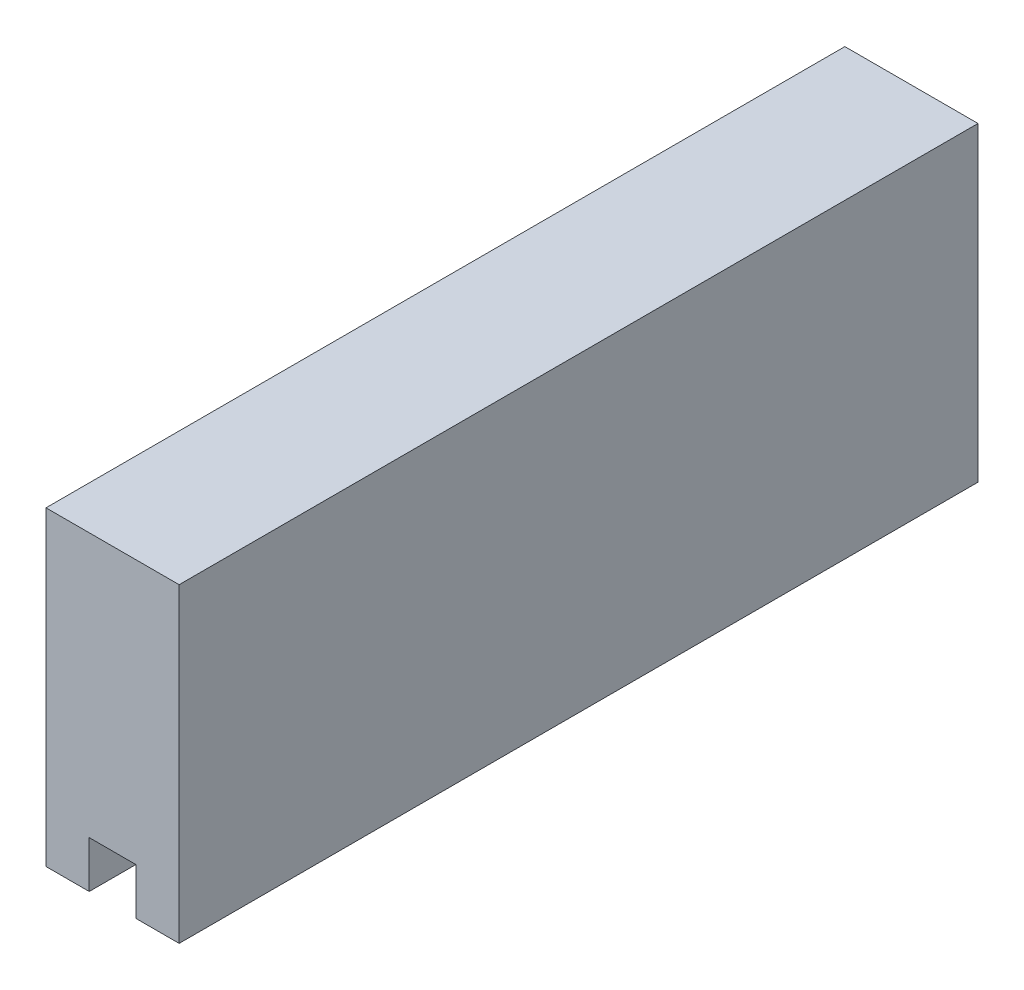
ISO-10303-21;
HEADER;
FILE_DESCRIPTION(('STEP AP214'),'2;1');
FILE_NAME('part.step','',(''),(''),'','','');
FILE_SCHEMA(('AUTOMOTIVE_DESIGN { 1 0 10303 214 1 1 1 1 }'));
ENDSEC;
DATA;
#1=APPLICATION_CONTEXT('core data for automotive mechanical design processes');
#2=APPLICATION_PROTOCOL_DEFINITION('international standard','automotive_design',2000,#1);
#3=PRODUCT_CONTEXT('',#1,'mechanical');
#4=PRODUCT('Part','Part','',(#3));
#5=PRODUCT_RELATED_PRODUCT_CATEGORY('part','',(#4));
#6=PRODUCT_DEFINITION_FORMATION('','',#4);
#7=PRODUCT_DEFINITION_CONTEXT('part definition',#1,'design');
#8=PRODUCT_DEFINITION('design','',#6,#7);
#9=PRODUCT_DEFINITION_SHAPE('','',#8);
#10=(LENGTH_UNIT() NAMED_UNIT(*) SI_UNIT(.MILLI.,.METRE.));
#11=(NAMED_UNIT(*) PLANE_ANGLE_UNIT() SI_UNIT($,.RADIAN.));
#12=(NAMED_UNIT(*) SI_UNIT($,.STERADIAN.) SOLID_ANGLE_UNIT());
#13=UNCERTAINTY_MEASURE_WITH_UNIT(LENGTH_MEASURE(1.E-05),#10,'distance_accuracy_value','');
#14=(GEOMETRIC_REPRESENTATION_CONTEXT(3) GLOBAL_UNCERTAINTY_ASSIGNED_CONTEXT((#13)) GLOBAL_UNIT_ASSIGNED_CONTEXT((#10,
#11,#12)) REPRESENTATION_CONTEXT('',''));
#15=CARTESIAN_POINT('',(0.,0.,0.));
#16=DIRECTION('',(0.,0.,1.));
#17=DIRECTION('',(1.,0.,0.));
#18=AXIS2_PLACEMENT_3D('',#15,#16,#17);
#19=CARTESIAN_POINT('',(-400000.,-35.000000000025,166.157731058682));
#20=DIRECTION('',(0.,1.,0.));
#21=DIRECTION('',(0.,0.,1.));
#22=AXIS2_PLACEMENT_3D('',#19,#20,#21);
#23=PLANE('',#22);
#24=DIRECTION('',(1.,0.,0.));
#25=VECTOR('',#24,1.);
#26=CARTESIAN_POINT('',(-400000.,-35.000000000025,-90.));
#27=LINE('',#26,#25);
#28=CARTESIAN_POINT('',(-14.9999999999864,-35.000000000025,-90.));
#29=VERTEX_POINT('',#28);
#30=CARTESIAN_POINT('',(-5.25728534807968,-35.000000000025,-90.));
#31=VERTEX_POINT('',#30);
#32=EDGE_CURVE('E146',#29,#31,#27,.T.);
#33=ORIENTED_EDGE('',*,*,#32,.T.);
#34=DIRECTION('',(0.,0.,-1.));
#35=VECTOR('',#34,1.);
#36=CARTESIAN_POINT('',(-5.25728534807968,-35.000000000025,90.));
#37=LINE('',#36,#35);
#38=CARTESIAN_POINT('',(-5.25728534807968,-35.000000000025,90.));
#39=VERTEX_POINT('',#38);
#40=EDGE_CURVE('E118',#39,#31,#37,.T.);
#41=ORIENTED_EDGE('',*,*,#40,.F.);
#42=DIRECTION('',(1.,0.,0.));
#43=VECTOR('',#42,1.);
#44=CARTESIAN_POINT('',(-400000.,-35.000000000025,90.));
#45=LINE('',#44,#43);
#46=CARTESIAN_POINT('',(-14.9999999999864,-35.000000000025,90.));
#47=VERTEX_POINT('',#46);
#48=EDGE_CURVE('E44',#47,#39,#45,.T.);
#49=ORIENTED_EDGE('',*,*,#48,.F.);
#50=DIRECTION('',(0.,0.,-1.));
#51=VECTOR('',#50,1.);
#52=CARTESIAN_POINT('',(-14.9999999999864,-35.000000000025,166.157731058682));
#53=LINE('',#52,#51);
#54=EDGE_CURVE('E151',#47,#29,#53,.T.);
#55=ORIENTED_EDGE('',*,*,#54,.T.);
#56=EDGE_LOOP('',(#33,#41,#49,#55));
#57=FACE_BOUND('',#56,.T.);
#58=ADVANCED_FACE('F35',(#57),#23,.F.);
#59=CARTESIAN_POINT('',(-14.9999999999295,-291545.,166.157731058682));
#60=DIRECTION('',(1.,0.,0.));
#61=DIRECTION('',(0.,1.,0.));
#62=AXIS2_PLACEMENT_3D('',#59,#60,#61);
#63=PLANE('',#62);
#64=DIRECTION('',(0.,-1.,0.));
#65=VECTOR('',#64,1.);
#66=CARTESIAN_POINT('',(-14.9999999999295,-291545.,90.));
#67=LINE('',#66,#65);
#68=CARTESIAN_POINT('',(-14.9999999999864,35.000000000025,90.));
#69=VERTEX_POINT('',#68);
#70=EDGE_CURVE('E156',#69,#47,#67,.T.);
#71=ORIENTED_EDGE('',*,*,#70,.F.);
#72=DIRECTION('',(0.,0.,-1.));
#73=VECTOR('',#72,1.);
#74=CARTESIAN_POINT('',(-14.9999999999864,35.000000000025,166.157731058682));
#75=LINE('',#74,#73);
#76=CARTESIAN_POINT('',(-14.9999999999864,35.000000000025,-90.));
#77=VERTEX_POINT('',#76);
#78=EDGE_CURVE('E39',#69,#77,#75,.T.);
#79=ORIENTED_EDGE('',*,*,#78,.T.);
#80=DIRECTION('',(0.,-1.,0.));
#81=VECTOR('',#80,1.);
#82=CARTESIAN_POINT('',(-14.9999999999295,-291545.,-90.));
#83=LINE('',#82,#81);
#84=EDGE_CURVE('E149',#77,#29,#83,.T.);
#85=ORIENTED_EDGE('',*,*,#84,.T.);
#86=ORIENTED_EDGE('',*,*,#54,.F.);
#87=EDGE_LOOP('',(#71,#79,#85,#86));
#88=FACE_BOUND('',#87,.T.);
#89=ADVANCED_FACE('F173',(#88),#63,.F.);
#90=CARTESIAN_POINT('',(5.25728534807968,-35.000000000025,90.));
#91=VERTEX_POINT('',#90);
#92=CARTESIAN_POINT('',(15.0000000000071,-35.000000000025,90.));
#93=VERTEX_POINT('',#92);
#94=EDGE_CURVE('E155',#91,#93,#45,.T.);
#95=ORIENTED_EDGE('',*,*,#94,.F.);
#96=DIRECTION('',(0.,0.,-1.));
#97=VECTOR('',#96,1.);
#98=CARTESIAN_POINT('',(5.25728534807968,-35.000000000025,90.));
#99=LINE('',#98,#97);
#100=CARTESIAN_POINT('',(5.25728534807968,-35.000000000025,-90.));
#101=VERTEX_POINT('',#100);
#102=EDGE_CURVE('E134',#91,#101,#99,.T.);
#103=ORIENTED_EDGE('',*,*,#102,.T.);
#104=CARTESIAN_POINT('',(15.0000000000071,-35.000000000025,-90.));
#105=VERTEX_POINT('',#104);
#106=EDGE_CURVE('E148',#101,#105,#27,.T.);
#107=ORIENTED_EDGE('',*,*,#106,.T.);
#108=DIRECTION('',(0.,0.,-1.));
#109=VECTOR('',#108,1.);
#110=CARTESIAN_POINT('',(15.0000000000071,-35.000000000025,166.157731058682));
#111=LINE('',#110,#109);
#112=EDGE_CURVE('E145',#93,#105,#111,.T.);
#113=ORIENTED_EDGE('',*,*,#112,.F.);
#114=EDGE_LOOP('',(#95,#103,#107,#113));
#115=FACE_BOUND('',#114,.T.);
#116=ADVANCED_FACE('F177',(#115),#23,.F.);
#117=CARTESIAN_POINT('',(15.0000000000432,-291545.,166.157731058682));
#118=DIRECTION('',(-1.,0.,0.));
#119=DIRECTION('',(0.,-1.,0.));
#120=AXIS2_PLACEMENT_3D('',#117,#118,#119);
#121=PLANE('',#120);
#122=DIRECTION('',(0.,1.,0.));
#123=VECTOR('',#122,1.);
#124=CARTESIAN_POINT('',(15.0000000000432,-291545.,90.));
#125=LINE('',#124,#123);
#126=CARTESIAN_POINT('',(14.9999999999864,35.000000000025,90.));
#127=VERTEX_POINT('',#126);
#128=EDGE_CURVE('E11',#93,#127,#125,.T.);
#129=ORIENTED_EDGE('',*,*,#128,.F.);
#130=ORIENTED_EDGE('',*,*,#112,.T.);
#131=DIRECTION('',(0.,1.,0.));
#132=VECTOR('',#131,1.);
#133=CARTESIAN_POINT('',(15.0000000000432,-291545.,-90.));
#134=LINE('',#133,#132);
#135=CARTESIAN_POINT('',(14.9999999999864,35.000000000025,-90.));
#136=VERTEX_POINT('',#135);
#137=EDGE_CURVE('E142',#105,#136,#134,.T.);
#138=ORIENTED_EDGE('',*,*,#137,.T.);
#139=DIRECTION('',(0.,0.,-1.));
#140=VECTOR('',#139,1.);
#141=CARTESIAN_POINT('',(14.9999999999864,35.000000000025,166.157731058682));
#142=LINE('',#141,#140);
#143=EDGE_CURVE('E141',#127,#136,#142,.T.);
#144=ORIENTED_EDGE('',*,*,#143,.F.);
#145=EDGE_LOOP('',(#129,#130,#138,#144));
#146=FACE_BOUND('',#145,.T.);
#147=ADVANCED_FACE('F169',(#146),#121,.F.);
#148=CARTESIAN_POINT('',(-400000.,35.000000000025,166.157731058682));
#149=DIRECTION('',(0.,-1.,0.));
#150=DIRECTION('',(0.,0.,-1.));
#151=AXIS2_PLACEMENT_3D('',#148,#149,#150);
#152=PLANE('',#151);
#153=DIRECTION('',(-1.,0.,0.));
#154=VECTOR('',#153,1.);
#155=CARTESIAN_POINT('',(-400000.,35.000000000025,90.));
#156=LINE('',#155,#154);
#157=EDGE_CURVE('E140',#127,#69,#156,.T.);
#158=ORIENTED_EDGE('',*,*,#157,.F.);
#159=ORIENTED_EDGE('',*,*,#143,.T.);
#160=DIRECTION('',(-1.,0.,0.));
#161=VECTOR('',#160,1.);
#162=CARTESIAN_POINT('',(-400000.,35.000000000025,-90.));
#163=LINE('',#162,#161);
#164=EDGE_CURVE('E138',#136,#77,#163,.T.);
#165=ORIENTED_EDGE('',*,*,#164,.T.);
#166=ORIENTED_EDGE('',*,*,#78,.F.);
#167=EDGE_LOOP('',(#158,#159,#165,#166));
#168=FACE_BOUND('',#167,.T.);
#169=ADVANCED_FACE('F163',(#168),#152,.F.);
#170=CARTESIAN_POINT('',(0.,0.,-90.));
#171=DIRECTION('',(0.,0.,1.));
#172=DIRECTION('',(1.,0.,0.));
#173=AXIS2_PLACEMENT_3D('',#170,#171,#172);
#174=PLANE('',#173);
#175=DIRECTION('',(1.,0.,0.));
#176=VECTOR('',#175,1.);
#177=CARTESIAN_POINT('',(-400000.,-24.4854293038657,-90.));
#178=LINE('',#177,#176);
#179=CARTESIAN_POINT('',(-5.25728534807968,-24.4854293038657,-90.));
#180=VERTEX_POINT('',#179);
#181=CARTESIAN_POINT('',(5.25728534807968,-24.4854293038657,-90.));
#182=VERTEX_POINT('',#181);
#183=EDGE_CURVE('E106',#180,#182,#178,.T.);
#184=ORIENTED_EDGE('',*,*,#183,.F.);
#185=DIRECTION('',(0.,1.,0.));
#186=VECTOR('',#185,1.);
#187=CARTESIAN_POINT('',(-5.25728534796599,-291545.,-90.));
#188=LINE('',#187,#186);
#189=EDGE_CURVE('E115',#31,#180,#188,.T.);
#190=ORIENTED_EDGE('',*,*,#189,.F.);
#191=ORIENTED_EDGE('',*,*,#32,.F.);
#192=ORIENTED_EDGE('',*,*,#84,.F.);
#193=ORIENTED_EDGE('',*,*,#164,.F.);
#194=ORIENTED_EDGE('',*,*,#137,.F.);
#195=ORIENTED_EDGE('',*,*,#106,.F.);
#196=DIRECTION('',(0.,-1.,0.));
#197=VECTOR('',#196,1.);
#198=CARTESIAN_POINT('',(5.25728534807968,-291545.,-90.));
#199=LINE('',#198,#197);
#200=EDGE_CURVE('E125',#182,#101,#199,.T.);
#201=ORIENTED_EDGE('',*,*,#200,.F.);
#202=EDGE_LOOP('',(#184,#190,#191,#192,#193,#194,#195,#201));
#203=FACE_BOUND('',#202,.T.);
#204=ADVANCED_FACE('F123',(#203),#174,.F.);
#205=CARTESIAN_POINT('',(0.,0.,90.));
#206=DIRECTION('',(0.,0.,1.));
#207=DIRECTION('',(1.,0.,0.));
#208=AXIS2_PLACEMENT_3D('',#205,#206,#207);
#209=PLANE('',#208);
#210=DIRECTION('',(0.,1.,0.));
#211=VECTOR('',#210,1.);
#212=CARTESIAN_POINT('',(-5.25728534796599,-291545.,90.));
#213=LINE('',#212,#211);
#214=CARTESIAN_POINT('',(-5.25728534807968,-24.4854293038657,90.));
#215=VERTEX_POINT('',#214);
#216=EDGE_CURVE('E127',#39,#215,#213,.T.);
#217=ORIENTED_EDGE('',*,*,#216,.T.);
#218=DIRECTION('',(1.,0.,0.));
#219=VECTOR('',#218,1.);
#220=CARTESIAN_POINT('',(-400000.,-24.4854293038657,90.));
#221=LINE('',#220,#219);
#222=CARTESIAN_POINT('',(5.25728534807968,-24.4854293038657,90.));
#223=VERTEX_POINT('',#222);
#224=EDGE_CURVE('E109',#215,#223,#221,.T.);
#225=ORIENTED_EDGE('',*,*,#224,.T.);
#226=DIRECTION('',(0.,-1.,0.));
#227=VECTOR('',#226,1.);
#228=CARTESIAN_POINT('',(5.25728534807968,-291545.,90.));
#229=LINE('',#228,#227);
#230=EDGE_CURVE('E52',#223,#91,#229,.T.);
#231=ORIENTED_EDGE('',*,*,#230,.T.);
#232=ORIENTED_EDGE('',*,*,#94,.T.);
#233=ORIENTED_EDGE('',*,*,#128,.T.);
#234=ORIENTED_EDGE('',*,*,#157,.T.);
#235=ORIENTED_EDGE('',*,*,#70,.T.);
#236=ORIENTED_EDGE('',*,*,#48,.T.);
#237=EDGE_LOOP('',(#217,#225,#231,#232,#233,#234,#235,#236));
#238=FACE_BOUND('',#237,.T.);
#239=ADVANCED_FACE('F37',(#238),#209,.T.);
#240=CARTESIAN_POINT('',(-5.25728534796599,-291545.,90.));
#241=DIRECTION('',(-1.,0.,0.));
#242=DIRECTION('',(0.,-1.,0.));
#243=AXIS2_PLACEMENT_3D('',#240,#241,#242);
#244=PLANE('',#243);
#245=DIRECTION('',(0.,0.,-1.));
#246=VECTOR('',#245,1.);
#247=CARTESIAN_POINT('',(-5.25728534807968,-24.4854293038657,90.));
#248=LINE('',#247,#246);
#249=EDGE_CURVE('E102',#215,#180,#248,.T.);
#250=ORIENTED_EDGE('',*,*,#249,.F.);
#251=ORIENTED_EDGE('',*,*,#216,.F.);
#252=ORIENTED_EDGE('',*,*,#40,.T.);
#253=ORIENTED_EDGE('',*,*,#189,.T.);
#254=EDGE_LOOP('',(#250,#251,#252,#253));
#255=FACE_BOUND('',#254,.T.);
#256=ADVANCED_FACE('F116',(#255),#244,.F.);
#257=CARTESIAN_POINT('',(5.25728534807968,-291545.,90.));
#258=DIRECTION('',(1.,0.,0.));
#259=DIRECTION('',(0.,0.,-1.));
#260=AXIS2_PLACEMENT_3D('',#257,#258,#259);
#261=PLANE('',#260);
#262=ORIENTED_EDGE('',*,*,#102,.F.);
#263=ORIENTED_EDGE('',*,*,#230,.F.);
#264=DIRECTION('',(0.,0.,-1.));
#265=VECTOR('',#264,1.);
#266=CARTESIAN_POINT('',(5.25728534807968,-24.4854293038657,90.));
#267=LINE('',#266,#265);
#268=EDGE_CURVE('E112',#223,#182,#267,.T.);
#269=ORIENTED_EDGE('',*,*,#268,.T.);
#270=ORIENTED_EDGE('',*,*,#200,.T.);
#271=EDGE_LOOP('',(#262,#263,#269,#270));
#272=FACE_BOUND('',#271,.T.);
#273=ADVANCED_FACE('F178',(#272),#261,.F.);
#274=CARTESIAN_POINT('',(-400000.,-24.4854293038657,90.));
#275=DIRECTION('',(0.,1.,0.));
#276=DIRECTION('',(0.,0.,1.));
#277=AXIS2_PLACEMENT_3D('',#274,#275,#276);
#278=PLANE('',#277);
#279=ORIENTED_EDGE('',*,*,#268,.F.);
#280=ORIENTED_EDGE('',*,*,#224,.F.);
#281=ORIENTED_EDGE('',*,*,#249,.T.);
#282=ORIENTED_EDGE('',*,*,#183,.T.);
#283=EDGE_LOOP('',(#279,#280,#281,#282));
#284=FACE_BOUND('',#283,.T.);
#285=ADVANCED_FACE('F104',(#284),#278,.F.);
#286=CLOSED_SHELL('',(#58,#89,#116,#147,#169,#204,#239,#256,#273,#285));
#287=MANIFOLD_SOLID_BREP('B2',#286);
#288=ADVANCED_BREP_SHAPE_REPRESENTATION('',(#18,#287),#14);
#289=SHAPE_DEFINITION_REPRESENTATION(#9,#288);
ENDSEC;
END-ISO-10303-21;
